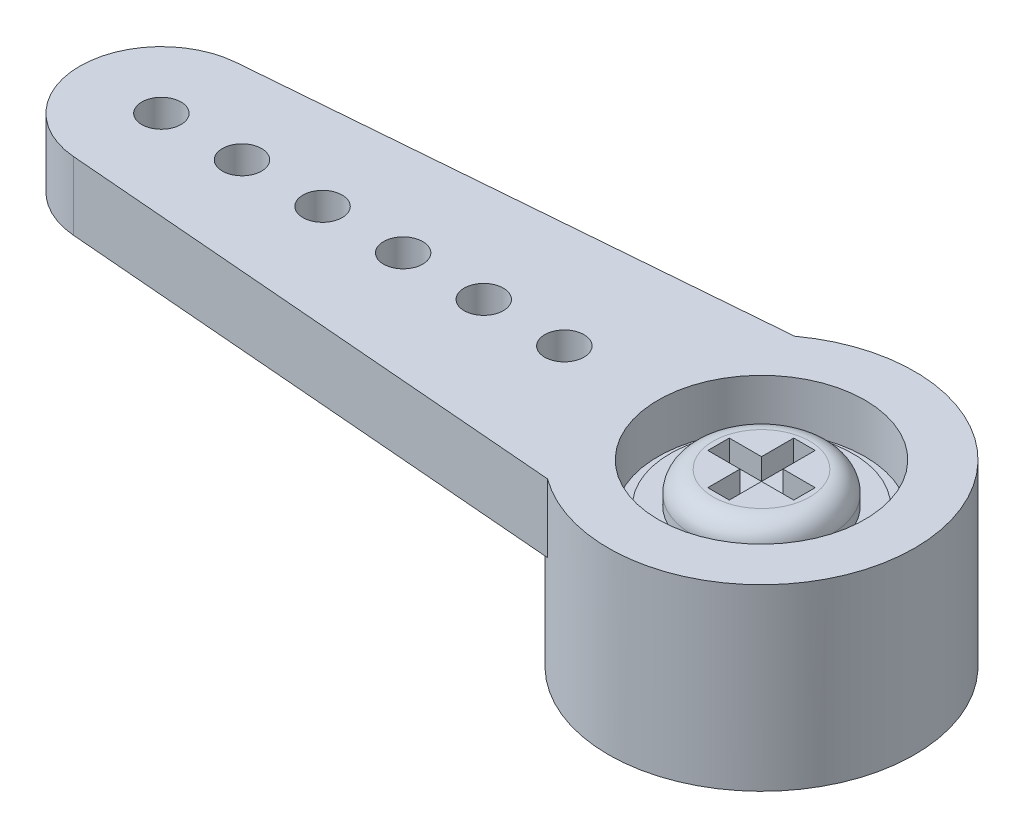
ISO-10303-21;
HEADER;
FILE_DESCRIPTION(('STEP AP214'),'2;1');
FILE_NAME('part.step','',(''),(''),'','','');
FILE_SCHEMA(('AUTOMOTIVE_DESIGN { 1 0 10303 214 1 1 1 1 }'));
ENDSEC;
DATA;
#1=APPLICATION_CONTEXT('core data for automotive mechanical design processes');
#2=APPLICATION_PROTOCOL_DEFINITION('international standard','automotive_design',2000,#1);
#3=PRODUCT_CONTEXT('',#1,'mechanical');
#4=PRODUCT('Part','Part','',(#3));
#5=PRODUCT_RELATED_PRODUCT_CATEGORY('part','',(#4));
#6=PRODUCT_DEFINITION_FORMATION('','',#4);
#7=PRODUCT_DEFINITION_CONTEXT('part definition',#1,'design');
#8=PRODUCT_DEFINITION('design','',#6,#7);
#9=PRODUCT_DEFINITION_SHAPE('','',#8);
#10=(LENGTH_UNIT() NAMED_UNIT(*) SI_UNIT(.MILLI.,.METRE.));
#11=(NAMED_UNIT(*) PLANE_ANGLE_UNIT() SI_UNIT($,.RADIAN.));
#12=(NAMED_UNIT(*) SI_UNIT($,.STERADIAN.) SOLID_ANGLE_UNIT());
#13=UNCERTAINTY_MEASURE_WITH_UNIT(LENGTH_MEASURE(1.E-05),#10,'distance_accuracy_value','');
#14=(GEOMETRIC_REPRESENTATION_CONTEXT(3) GLOBAL_UNCERTAINTY_ASSIGNED_CONTEXT((#13)) GLOBAL_UNIT_ASSIGNED_CONTEXT((#10,
#11,#12)) REPRESENTATION_CONTEXT('',''));
#15=CARTESIAN_POINT('',(0.,0.,0.));
#16=DIRECTION('',(0.,0.,1.));
#17=DIRECTION('',(1.,0.,0.));
#18=AXIS2_PLACEMENT_3D('',#15,#16,#17);
#19=CARTESIAN_POINT('',(0.,0.6604,0.));
#20=DIRECTION('',(0.,1.,0.));
#21=DIRECTION('',(0.,0.,1.));
#22=AXIS2_PLACEMENT_3D('',#19,#20,#21);
#23=PLANE('',#22);
#24=CARTESIAN_POINT('',(0.,0.6604,0.));
#25=DIRECTION('',(0.,1.,0.));
#26=DIRECTION('',(0.,0.,1.));
#27=AXIS2_PLACEMENT_3D('',#24,#25,#26);
#28=CIRCLE('',#27,2.159);
#29=CARTESIAN_POINT('',(0.,0.6604,2.159));
#30=VERTEX_POINT('',#29);
#31=EDGE_CURVE('E262',#30,#30,#28,.T.);
#32=ORIENTED_EDGE('',*,*,#31,.T.);
#33=EDGE_LOOP('',(#32));
#34=FACE_BOUND('',#33,.T.);
#35=CARTESIAN_POINT('',(0.,0.6604,0.));
#36=DIRECTION('',(0.,1.,0.));
#37=DIRECTION('',(0.,0.,1.));
#38=AXIS2_PLACEMENT_3D('',#35,#36,#37);
#39=CIRCLE('',#38,1.651);
#40=CARTESIAN_POINT('',(0.,0.6604,-1.651));
#41=VERTEX_POINT('',#40);
#42=EDGE_CURVE('E239',#41,#41,#39,.T.);
#43=ORIENTED_EDGE('',*,*,#42,.F.);
#44=EDGE_LOOP('',(#43));
#45=FACE_BOUND('',#44,.T.);
#46=ADVANCED_FACE('F32',(#34,#45),#23,.T.);
#47=CARTESIAN_POINT('',(0.,0.4572,0.));
#48=DIRECTION('',(0.,1.,0.));
#49=DIRECTION('',(0.,0.,1.));
#50=AXIS2_PLACEMENT_3D('',#47,#48,#49);
#51=PLANE('',#50);
#52=CARTESIAN_POINT('',(0.,0.4572,0.));
#53=DIRECTION('',(0.,1.,0.));
#54=DIRECTION('',(0.,0.,1.));
#55=AXIS2_PLACEMENT_3D('',#52,#53,#54);
#56=CIRCLE('',#55,2.44475);
#57=CARTESIAN_POINT('',(0.,0.4572,2.44475));
#58=VERTEX_POINT('',#57);
#59=EDGE_CURVE('E274',#58,#58,#56,.T.);
#60=ORIENTED_EDGE('',*,*,#59,.T.);
#61=EDGE_LOOP('',(#60));
#62=FACE_BOUND('',#61,.T.);
#63=CARTESIAN_POINT('',(0.,0.4572,0.));
#64=DIRECTION('',(0.,1.,0.));
#65=DIRECTION('',(0.,0.,1.));
#66=AXIS2_PLACEMENT_3D('',#63,#64,#65);
#67=CIRCLE('',#66,2.159);
#68=CARTESIAN_POINT('',(0.,0.4572,2.159));
#69=VERTEX_POINT('',#68);
#70=EDGE_CURVE('E261',#69,#69,#67,.T.);
#71=ORIENTED_EDGE('',*,*,#70,.F.);
#72=EDGE_LOOP('',(#71));
#73=FACE_BOUND('',#72,.T.);
#74=ADVANCED_FACE('F360',(#62,#73),#51,.T.);
#75=CARTESIAN_POINT('',(0.,-2.6162,0.));
#76=DIRECTION('',(0.,1.,0.));
#77=DIRECTION('',(0.,0.,1.));
#78=AXIS2_PLACEMENT_3D('',#75,#76,#77);
#79=CYLINDRICAL_SURFACE('',#78,1.27);
#80=CARTESIAN_POINT('',(0.,0.4572,0.));
#81=DIRECTION('',(0.,1.,0.));
#82=DIRECTION('',(0.,0.,1.));
#83=AXIS2_PLACEMENT_3D('',#80,#81,#82);
#84=CIRCLE('',#83,1.27);
#85=CARTESIAN_POINT('',(0.,0.4572,1.27));
#86=VERTEX_POINT('',#85);
#87=EDGE_CURVE('E277',#86,#86,#84,.F.);
#88=ORIENTED_EDGE('',*,*,#87,.F.);
#89=EDGE_LOOP('',(#88));
#90=FACE_BOUND('',#89,.T.);
#91=CARTESIAN_POINT('',(0.,-0.2794,0.));
#92=DIRECTION('',(0.,-1.,0.));
#93=DIRECTION('',(0.,0.,-1.));
#94=AXIS2_PLACEMENT_3D('',#91,#92,#93);
#95=CIRCLE('',#94,1.27);
#96=CARTESIAN_POINT('',(0.,-0.2794,-1.27));
#97=VERTEX_POINT('',#96);
#98=EDGE_CURVE('E271',#97,#97,#95,.F.);
#99=ORIENTED_EDGE('',*,*,#98,.F.);
#100=EDGE_LOOP('',(#99));
#101=FACE_BOUND('',#100,.T.);
#102=ADVANCED_FACE('F366',(#90,#101),#79,.F.);
#103=CARTESIAN_POINT('',(0.,1.6129,0.));
#104=DIRECTION('',(0.,-1.,0.));
#105=DIRECTION('',(0.,0.,-1.));
#106=AXIS2_PLACEMENT_3D('',#103,#104,#105);
#107=CYLINDRICAL_SURFACE('',#106,3.6195);
#108=DIRECTION('',(0.,-1.,0.));
#109=VECTOR('',#108,1.);
#110=CARTESIAN_POINT('',(-2.13741415032277,1.6129,2.921));
#111=LINE('',#110,#109);
#112=CARTESIAN_POINT('',(-2.13741415032277,1.6129,2.921));
#113=VERTEX_POINT('',#112);
#114=CARTESIAN_POINT('',(-2.13741415032277,0.,2.921));
#115=VERTEX_POINT('',#114);
#116=EDGE_CURVE('E316',#113,#115,#111,.T.);
#117=ORIENTED_EDGE('',*,*,#116,.T.);
#118=CARTESIAN_POINT('',(0.,0.,0.));
#119=DIRECTION('',(0.,1.,0.));
#120=DIRECTION('',(0.,0.,1.));
#121=AXIS2_PLACEMENT_3D('',#118,#119,#120);
#122=CIRCLE('',#121,3.6195);
#123=CARTESIAN_POINT('',(-2.13741415032277,0.,-2.921));
#124=VERTEX_POINT('',#123);
#125=EDGE_CURVE('E329',#124,#115,#122,.T.);
#126=ORIENTED_EDGE('',*,*,#125,.F.);
#127=DIRECTION('',(0.,-1.,0.));
#128=VECTOR('',#127,1.);
#129=CARTESIAN_POINT('',(-2.13741415032277,1.6129,-2.921));
#130=LINE('',#129,#128);
#131=CARTESIAN_POINT('',(-2.13741415032277,1.6129,-2.921));
#132=VERTEX_POINT('',#131);
#133=EDGE_CURVE('E327',#132,#124,#130,.T.);
#134=ORIENTED_EDGE('',*,*,#133,.F.);
#135=CARTESIAN_POINT('',(0.,1.6129,0.));
#136=DIRECTION('',(0.,1.,0.));
#137=DIRECTION('',(0.,0.,1.));
#138=AXIS2_PLACEMENT_3D('',#135,#136,#137);
#139=CIRCLE('',#138,3.6195);
#140=EDGE_CURVE('E309',#113,#132,#139,.T.);
#141=ORIENTED_EDGE('',*,*,#140,.F.);
#142=EDGE_LOOP('',(#117,#126,#134,#141));
#143=FACE_BOUND('',#142,.T.);
#144=CARTESIAN_POINT('',(0.,-2.6162,0.));
#145=DIRECTION('',(0.,1.,0.));
#146=DIRECTION('',(0.,0.,1.));
#147=AXIS2_PLACEMENT_3D('',#144,#145,#146);
#148=CIRCLE('',#147,3.6195);
#149=CARTESIAN_POINT('',(0.,-2.6162,3.6195));
#150=VERTEX_POINT('',#149);
#151=EDGE_CURVE('E305',#150,#150,#148,.T.);
#152=ORIENTED_EDGE('',*,*,#151,.T.);
#153=EDGE_LOOP('',(#152));
#154=FACE_BOUND('',#153,.T.);
#155=ADVANCED_FACE('F417',(#143,#154),#107,.T.);
#156=CARTESIAN_POINT('',(-14.3430596900559,1.6129,-1.92399194172469));
#157=DIRECTION('',(0.0814130180562945,0.,0.996680450541178));
#158=DIRECTION('',(0.996680450541178,0.,-0.0814130180562945));
#159=AXIS2_PLACEMENT_3D('',#156,#157,#158);
#160=PLANE('',#159);
#161=DIRECTION('',(-0.996680450541178,0.,0.0814130180562945));
#162=VECTOR('',#161,1.);
#163=CARTESIAN_POINT('',(-14.3430596900559,0.,-1.92399194172469));
#164=LINE('',#163,#162);
#165=CARTESIAN_POINT('',(-14.3430596900559,0.,-1.92399194172469));
#166=VERTEX_POINT('',#165);
#167=EDGE_CURVE('E308',#124,#166,#164,.T.);
#168=ORIENTED_EDGE('',*,*,#167,.T.);
#169=DIRECTION('',(0.,-1.,0.));
#170=VECTOR('',#169,1.);
#171=CARTESIAN_POINT('',(-14.3430596900559,1.6129,-1.92399194172469));
#172=LINE('',#171,#170);
#173=CARTESIAN_POINT('',(-14.3430596900559,1.6129,-1.92399194172469));
#174=VERTEX_POINT('',#173);
#175=EDGE_CURVE('E325',#174,#166,#172,.T.);
#176=ORIENTED_EDGE('',*,*,#175,.F.);
#177=DIRECTION('',(-0.996680450541178,0.,0.0814130180562945));
#178=VECTOR('',#177,1.);
#179=CARTESIAN_POINT('',(-14.3430596900559,1.6129,-1.92399194172469));
#180=LINE('',#179,#178);
#181=EDGE_CURVE('E83',#132,#174,#180,.T.);
#182=ORIENTED_EDGE('',*,*,#181,.F.);
#183=ORIENTED_EDGE('',*,*,#133,.T.);
#184=EDGE_LOOP('',(#168,#176,#182,#183));
#185=FACE_BOUND('',#184,.T.);
#186=ADVANCED_FACE('F441',(#185),#160,.F.);
#187=CARTESIAN_POINT('',(-14.1859,1.6129,0.));
#188=DIRECTION('',(0.,-1.,0.));
#189=DIRECTION('',(0.,0.,-1.));
#190=AXIS2_PLACEMENT_3D('',#187,#188,#189);
#191=CYLINDRICAL_SURFACE('',#190,1.9304);
#192=CARTESIAN_POINT('',(-14.1859,0.,0.));
#193=DIRECTION('',(0.,1.,0.));
#194=DIRECTION('',(0.,0.,1.));
#195=AXIS2_PLACEMENT_3D('',#192,#193,#194);
#196=CIRCLE('',#195,1.9304);
#197=CARTESIAN_POINT('',(-14.3430596900559,0.,1.92399194172469));
#198=VERTEX_POINT('',#197);
#199=EDGE_CURVE('E75',#166,#198,#196,.T.);
#200=ORIENTED_EDGE('',*,*,#199,.T.);
#201=DIRECTION('',(0.,-1.,0.));
#202=VECTOR('',#201,1.);
#203=CARTESIAN_POINT('',(-14.3430596900559,1.6129,1.92399194172469));
#204=LINE('',#203,#202);
#205=CARTESIAN_POINT('',(-14.3430596900559,1.6129,1.92399194172469));
#206=VERTEX_POINT('',#205);
#207=EDGE_CURVE('E323',#206,#198,#204,.T.);
#208=ORIENTED_EDGE('',*,*,#207,.F.);
#209=CARTESIAN_POINT('',(-14.1859,1.6129,0.));
#210=DIRECTION('',(0.,1.,0.));
#211=DIRECTION('',(0.,0.,1.));
#212=AXIS2_PLACEMENT_3D('',#209,#210,#211);
#213=CIRCLE('',#212,1.9304);
#214=EDGE_CURVE('E313',#174,#206,#213,.T.);
#215=ORIENTED_EDGE('',*,*,#214,.F.);
#216=ORIENTED_EDGE('',*,*,#175,.T.);
#217=EDGE_LOOP('',(#200,#208,#215,#216));
#218=FACE_BOUND('',#217,.T.);
#219=ADVANCED_FACE('F437',(#218),#191,.T.);
#220=CARTESIAN_POINT('',(-14.3430596900559,1.6129,1.92399194172469));
#221=DIRECTION('',(0.0814130180562943,0.,-0.996680450541178));
#222=DIRECTION('',(-0.996680450541178,0.,-0.0814130180562943));
#223=AXIS2_PLACEMENT_3D('',#220,#221,#222);
#224=PLANE('',#223);
#225=DIRECTION('',(0.996680450541178,0.,0.0814130180562943));
#226=VECTOR('',#225,1.);
#227=CARTESIAN_POINT('',(-14.3430596900559,0.,1.92399194172469));
#228=LINE('',#227,#226);
#229=EDGE_CURVE('E311',#198,#115,#228,.T.);
#230=ORIENTED_EDGE('',*,*,#229,.T.);
#231=ORIENTED_EDGE('',*,*,#116,.F.);
#232=DIRECTION('',(0.996680450541178,0.,0.0814130180562943));
#233=VECTOR('',#232,1.);
#234=CARTESIAN_POINT('',(-14.3430596900559,1.6129,1.92399194172469));
#235=LINE('',#234,#233);
#236=EDGE_CURVE('E56',#206,#113,#235,.T.);
#237=ORIENTED_EDGE('',*,*,#236,.F.);
#238=ORIENTED_EDGE('',*,*,#207,.T.);
#239=EDGE_LOOP('',(#230,#231,#237,#238));
#240=FACE_BOUND('',#239,.T.);
#241=ADVANCED_FACE('F430',(#240),#224,.F.);
#242=CARTESIAN_POINT('',(0.,1.6129,0.));
#243=DIRECTION('',(0.,1.,0.));
#244=DIRECTION('',(0.,0.,1.));
#245=AXIS2_PLACEMENT_3D('',#242,#243,#244);
#246=PLANE('',#245);
#247=CARTESIAN_POINT('',(0.,1.6129,0.));
#248=DIRECTION('',(0.,1.,0.));
#249=DIRECTION('',(0.,0.,1.));
#250=AXIS2_PLACEMENT_3D('',#247,#248,#249);
#251=CIRCLE('',#250,2.44475);
#252=CARTESIAN_POINT('',(0.,1.6129,2.44475));
#253=VERTEX_POINT('',#252);
#254=EDGE_CURVE('E278',#253,#253,#251,.T.);
#255=ORIENTED_EDGE('',*,*,#254,.F.);
#256=EDGE_LOOP('',(#255));
#257=FACE_BOUND('',#256,.T.);
#258=CARTESIAN_POINT('',(-12.2809,1.6129,0.));
#259=DIRECTION('',(0.,1.,0.));
#260=DIRECTION('',(0.,0.,1.));
#261=AXIS2_PLACEMENT_3D('',#258,#259,#260);
#262=CIRCLE('',#261,0.46355);
#263=CARTESIAN_POINT('',(-12.2809,1.6129,0.46355));
#264=VERTEX_POINT('',#263);
#265=EDGE_CURVE('E281',#264,#264,#262,.T.);
#266=ORIENTED_EDGE('',*,*,#265,.F.);
#267=EDGE_LOOP('',(#266));
#268=FACE_BOUND('',#267,.T.);
#269=CARTESIAN_POINT('',(-10.3759,1.6129,0.));
#270=DIRECTION('',(0.,1.,0.));
#271=DIRECTION('',(0.,0.,1.));
#272=AXIS2_PLACEMENT_3D('',#269,#270,#271);
#273=CIRCLE('',#272,0.46355);
#274=CARTESIAN_POINT('',(-10.3759,1.6129,0.46355));
#275=VERTEX_POINT('',#274);
#276=EDGE_CURVE('E285',#275,#275,#273,.T.);
#277=ORIENTED_EDGE('',*,*,#276,.F.);
#278=EDGE_LOOP('',(#277));
#279=FACE_BOUND('',#278,.T.);
#280=CARTESIAN_POINT('',(-8.4709,1.6129,0.));
#281=DIRECTION('',(0.,1.,0.));
#282=DIRECTION('',(0.,0.,1.));
#283=AXIS2_PLACEMENT_3D('',#280,#281,#282);
#284=CIRCLE('',#283,0.46355);
#285=CARTESIAN_POINT('',(-8.4709,1.6129,0.46355));
#286=VERTEX_POINT('',#285);
#287=EDGE_CURVE('E289',#286,#286,#284,.T.);
#288=ORIENTED_EDGE('',*,*,#287,.F.);
#289=EDGE_LOOP('',(#288));
#290=FACE_BOUND('',#289,.T.);
#291=CARTESIAN_POINT('',(-6.5659,1.6129,0.));
#292=DIRECTION('',(0.,1.,0.));
#293=DIRECTION('',(0.,0.,1.));
#294=AXIS2_PLACEMENT_3D('',#291,#292,#293);
#295=CIRCLE('',#294,0.46355);
#296=CARTESIAN_POINT('',(-6.5659,1.6129,0.46355));
#297=VERTEX_POINT('',#296);
#298=EDGE_CURVE('E293',#297,#297,#295,.T.);
#299=ORIENTED_EDGE('',*,*,#298,.F.);
#300=EDGE_LOOP('',(#299));
#301=FACE_BOUND('',#300,.T.);
#302=CARTESIAN_POINT('',(-4.6609,1.6129,0.));
#303=DIRECTION('',(0.,1.,0.));
#304=DIRECTION('',(0.,0.,1.));
#305=AXIS2_PLACEMENT_3D('',#302,#303,#304);
#306=CIRCLE('',#305,0.46355);
#307=CARTESIAN_POINT('',(-4.6609,1.6129,0.46355));
#308=VERTEX_POINT('',#307);
#309=EDGE_CURVE('E297',#308,#308,#306,.T.);
#310=ORIENTED_EDGE('',*,*,#309,.F.);
#311=EDGE_LOOP('',(#310));
#312=FACE_BOUND('',#311,.T.);
#313=CARTESIAN_POINT('',(-14.1859,1.6129,0.));
#314=DIRECTION('',(0.,1.,0.));
#315=DIRECTION('',(0.,0.,1.));
#316=AXIS2_PLACEMENT_3D('',#313,#314,#315);
#317=CIRCLE('',#316,0.46355);
#318=CARTESIAN_POINT('',(-14.1859,1.6129,0.463550000000002));
#319=VERTEX_POINT('',#318);
#320=EDGE_CURVE('E301',#319,#319,#317,.T.);
#321=ORIENTED_EDGE('',*,*,#320,.F.);
#322=EDGE_LOOP('',(#321));
#323=FACE_BOUND('',#322,.T.);
#324=ORIENTED_EDGE('',*,*,#236,.T.);
#325=ORIENTED_EDGE('',*,*,#140,.T.);
#326=ORIENTED_EDGE('',*,*,#181,.T.);
#327=ORIENTED_EDGE('',*,*,#214,.T.);
#328=EDGE_LOOP('',(#324,#325,#326,#327));
#329=FACE_BOUND('',#328,.T.);
#330=ADVANCED_FACE('F427',(#257,#268,#279,#290,#301,#312,#323,#329),#246,.T.);
#331=CARTESIAN_POINT('',(0.,0.,0.));
#332=DIRECTION('',(0.,1.,0.));
#333=DIRECTION('',(0.,0.,1.));
#334=AXIS2_PLACEMENT_3D('',#331,#332,#333);
#335=PLANE('',#334);
#336=CARTESIAN_POINT('',(-12.2809,0.,0.));
#337=DIRECTION('',(0.,1.,0.));
#338=DIRECTION('',(0.,0.,1.));
#339=AXIS2_PLACEMENT_3D('',#336,#337,#338);
#340=CIRCLE('',#339,0.46355);
#341=CARTESIAN_POINT('',(-12.2809,0.,0.46355));
#342=VERTEX_POINT('',#341);
#343=EDGE_CURVE('E284',#342,#342,#340,.T.);
#344=ORIENTED_EDGE('',*,*,#343,.T.);
#345=EDGE_LOOP('',(#344));
#346=FACE_BOUND('',#345,.T.);
#347=CARTESIAN_POINT('',(-10.3759,0.,0.));
#348=DIRECTION('',(0.,1.,0.));
#349=DIRECTION('',(0.,0.,1.));
#350=AXIS2_PLACEMENT_3D('',#347,#348,#349);
#351=CIRCLE('',#350,0.46355);
#352=CARTESIAN_POINT('',(-10.3759,0.,0.46355));
#353=VERTEX_POINT('',#352);
#354=EDGE_CURVE('E288',#353,#353,#351,.T.);
#355=ORIENTED_EDGE('',*,*,#354,.T.);
#356=EDGE_LOOP('',(#355));
#357=FACE_BOUND('',#356,.T.);
#358=CARTESIAN_POINT('',(-8.4709,0.,0.));
#359=DIRECTION('',(0.,1.,0.));
#360=DIRECTION('',(0.,0.,1.));
#361=AXIS2_PLACEMENT_3D('',#358,#359,#360);
#362=CIRCLE('',#361,0.46355);
#363=CARTESIAN_POINT('',(-8.4709,0.,0.46355));
#364=VERTEX_POINT('',#363);
#365=EDGE_CURVE('E292',#364,#364,#362,.T.);
#366=ORIENTED_EDGE('',*,*,#365,.T.);
#367=EDGE_LOOP('',(#366));
#368=FACE_BOUND('',#367,.T.);
#369=CARTESIAN_POINT('',(-6.5659,0.,0.));
#370=DIRECTION('',(0.,1.,0.));
#371=DIRECTION('',(0.,0.,1.));
#372=AXIS2_PLACEMENT_3D('',#369,#370,#371);
#373=CIRCLE('',#372,0.46355);
#374=CARTESIAN_POINT('',(-6.5659,0.,0.46355));
#375=VERTEX_POINT('',#374);
#376=EDGE_CURVE('E296',#375,#375,#373,.T.);
#377=ORIENTED_EDGE('',*,*,#376,.T.);
#378=EDGE_LOOP('',(#377));
#379=FACE_BOUND('',#378,.T.);
#380=CARTESIAN_POINT('',(-4.6609,0.,0.));
#381=DIRECTION('',(0.,1.,0.));
#382=DIRECTION('',(0.,0.,1.));
#383=AXIS2_PLACEMENT_3D('',#380,#381,#382);
#384=CIRCLE('',#383,0.46355);
#385=CARTESIAN_POINT('',(-4.6609,0.,0.46355));
#386=VERTEX_POINT('',#385);
#387=EDGE_CURVE('E300',#386,#386,#384,.T.);
#388=ORIENTED_EDGE('',*,*,#387,.T.);
#389=EDGE_LOOP('',(#388));
#390=FACE_BOUND('',#389,.T.);
#391=CARTESIAN_POINT('',(-14.1859,0.,0.));
#392=DIRECTION('',(0.,1.,0.));
#393=DIRECTION('',(0.,0.,1.));
#394=AXIS2_PLACEMENT_3D('',#391,#392,#393);
#395=CIRCLE('',#394,0.46355);
#396=CARTESIAN_POINT('',(-14.1859,0.,0.463550000000002));
#397=VERTEX_POINT('',#396);
#398=EDGE_CURVE('E304',#397,#397,#395,.T.);
#399=ORIENTED_EDGE('',*,*,#398,.T.);
#400=EDGE_LOOP('',(#399));
#401=FACE_BOUND('',#400,.T.);
#402=ORIENTED_EDGE('',*,*,#167,.F.);
#403=ORIENTED_EDGE('',*,*,#125,.T.);
#404=ORIENTED_EDGE('',*,*,#229,.F.);
#405=ORIENTED_EDGE('',*,*,#199,.F.);
#406=EDGE_LOOP('',(#402,#403,#404,#405));
#407=FACE_BOUND('',#406,.T.);
#408=ADVANCED_FACE('F425',(#346,#357,#368,#379,#390,#401,#407),#335,.F.);
#409=CARTESIAN_POINT('',(0.,-2.6162,0.));
#410=DIRECTION('',(0.,1.,0.));
#411=DIRECTION('',(0.,0.,1.));
#412=AXIS2_PLACEMENT_3D('',#409,#410,#411);
#413=PLANE('',#412);
#414=CARTESIAN_POINT('',(0.,-2.6162,0.));
#415=DIRECTION('',(0.,-1.,0.));
#416=DIRECTION('',(0.,0.,-1.));
#417=AXIS2_PLACEMENT_3D('',#414,#415,#416);
#418=CIRCLE('',#417,2.286);
#419=CARTESIAN_POINT('',(0.,-2.6162,-2.286));
#420=VERTEX_POINT('',#419);
#421=EDGE_CURVE('E265',#420,#420,#418,.T.);
#422=ORIENTED_EDGE('',*,*,#421,.F.);
#423=EDGE_LOOP('',(#422));
#424=FACE_BOUND('',#423,.T.);
#425=ORIENTED_EDGE('',*,*,#151,.F.);
#426=EDGE_LOOP('',(#425));
#427=FACE_BOUND('',#426,.T.);
#428=ADVANCED_FACE('F421',(#424,#427),#413,.F.);
#429=CARTESIAN_POINT('',(-14.1859,-2.6162,0.));
#430=DIRECTION('',(0.,1.,0.));
#431=DIRECTION('',(0.,0.,1.));
#432=AXIS2_PLACEMENT_3D('',#429,#430,#431);
#433=CYLINDRICAL_SURFACE('',#432,0.46355);
#434=ORIENTED_EDGE('',*,*,#320,.T.);
#435=EDGE_LOOP('',(#434));
#436=FACE_BOUND('',#435,.T.);
#437=ORIENTED_EDGE('',*,*,#398,.F.);
#438=EDGE_LOOP('',(#437));
#439=FACE_BOUND('',#438,.T.);
#440=ADVANCED_FACE('F413',(#436,#439),#433,.F.);
#441=CARTESIAN_POINT('',(-4.6609,-2.6162,0.));
#442=DIRECTION('',(0.,1.,0.));
#443=DIRECTION('',(0.,0.,1.));
#444=AXIS2_PLACEMENT_3D('',#441,#442,#443);
#445=CYLINDRICAL_SURFACE('',#444,0.46355);
#446=ORIENTED_EDGE('',*,*,#309,.T.);
#447=EDGE_LOOP('',(#446));
#448=FACE_BOUND('',#447,.T.);
#449=ORIENTED_EDGE('',*,*,#387,.F.);
#450=EDGE_LOOP('',(#449));
#451=FACE_BOUND('',#450,.T.);
#452=ADVANCED_FACE('F409',(#448,#451),#445,.F.);
#453=CARTESIAN_POINT('',(-6.5659,-2.6162,0.));
#454=DIRECTION('',(0.,1.,0.));
#455=DIRECTION('',(0.,0.,1.));
#456=AXIS2_PLACEMENT_3D('',#453,#454,#455);
#457=CYLINDRICAL_SURFACE('',#456,0.46355);
#458=ORIENTED_EDGE('',*,*,#298,.T.);
#459=EDGE_LOOP('',(#458));
#460=FACE_BOUND('',#459,.T.);
#461=ORIENTED_EDGE('',*,*,#376,.F.);
#462=EDGE_LOOP('',(#461));
#463=FACE_BOUND('',#462,.T.);
#464=ADVANCED_FACE('F405',(#460,#463),#457,.F.);
#465=CARTESIAN_POINT('',(-8.4709,-2.6162,0.));
#466=DIRECTION('',(0.,1.,0.));
#467=DIRECTION('',(0.,0.,1.));
#468=AXIS2_PLACEMENT_3D('',#465,#466,#467);
#469=CYLINDRICAL_SURFACE('',#468,0.46355);
#470=ORIENTED_EDGE('',*,*,#287,.T.);
#471=EDGE_LOOP('',(#470));
#472=FACE_BOUND('',#471,.T.);
#473=ORIENTED_EDGE('',*,*,#365,.F.);
#474=EDGE_LOOP('',(#473));
#475=FACE_BOUND('',#474,.T.);
#476=ADVANCED_FACE('F401',(#472,#475),#469,.F.);
#477=CARTESIAN_POINT('',(-10.3759,-2.6162,0.));
#478=DIRECTION('',(0.,1.,0.));
#479=DIRECTION('',(0.,0.,1.));
#480=AXIS2_PLACEMENT_3D('',#477,#478,#479);
#481=CYLINDRICAL_SURFACE('',#480,0.46355);
#482=ORIENTED_EDGE('',*,*,#276,.T.);
#483=EDGE_LOOP('',(#482));
#484=FACE_BOUND('',#483,.T.);
#485=ORIENTED_EDGE('',*,*,#354,.F.);
#486=EDGE_LOOP('',(#485));
#487=FACE_BOUND('',#486,.T.);
#488=ADVANCED_FACE('F397',(#484,#487),#481,.F.);
#489=CARTESIAN_POINT('',(-12.2809,-2.6162,0.));
#490=DIRECTION('',(0.,1.,0.));
#491=DIRECTION('',(0.,0.,1.));
#492=AXIS2_PLACEMENT_3D('',#489,#490,#491);
#493=CYLINDRICAL_SURFACE('',#492,0.46355);
#494=ORIENTED_EDGE('',*,*,#265,.T.);
#495=EDGE_LOOP('',(#494));
#496=FACE_BOUND('',#495,.T.);
#497=ORIENTED_EDGE('',*,*,#343,.F.);
#498=EDGE_LOOP('',(#497));
#499=FACE_BOUND('',#498,.T.);
#500=ADVANCED_FACE('F393',(#496,#499),#493,.F.);
#501=CARTESIAN_POINT('',(0.,0.4572,0.));
#502=DIRECTION('',(0.,1.,0.));
#503=DIRECTION('',(0.,0.,1.));
#504=AXIS2_PLACEMENT_3D('',#501,#502,#503);
#505=CYLINDRICAL_SURFACE('',#504,2.44475);
#506=ORIENTED_EDGE('',*,*,#59,.F.);
#507=EDGE_LOOP('',(#506));
#508=FACE_BOUND('',#507,.T.);
#509=ORIENTED_EDGE('',*,*,#254,.T.);
#510=EDGE_LOOP('',(#509));
#511=FACE_BOUND('',#510,.T.);
#512=ADVANCED_FACE('F386',(#508,#511),#505,.F.);
#513=CARTESIAN_POINT('',(0.,-0.2794,0.));
#514=DIRECTION('',(0.,-1.,0.));
#515=DIRECTION('',(0.,0.,-1.));
#516=AXIS2_PLACEMENT_3D('',#513,#514,#515);
#517=PLANE('',#516);
#518=CARTESIAN_POINT('',(0.,-0.2794,0.));
#519=DIRECTION('',(0.,-1.,0.));
#520=DIRECTION('',(0.,0.,-1.));
#521=AXIS2_PLACEMENT_3D('',#518,#519,#520);
#522=CIRCLE('',#521,2.286);
#523=CARTESIAN_POINT('',(0.,-0.2794,-2.286));
#524=VERTEX_POINT('',#523);
#525=EDGE_CURVE('E268',#524,#524,#522,.T.);
#526=ORIENTED_EDGE('',*,*,#525,.T.);
#527=EDGE_LOOP('',(#526));
#528=FACE_BOUND('',#527,.T.);
#529=ORIENTED_EDGE('',*,*,#98,.T.);
#530=EDGE_LOOP('',(#529));
#531=FACE_BOUND('',#530,.T.);
#532=ADVANCED_FACE('F383',(#528,#531),#517,.T.);
#533=CARTESIAN_POINT('',(0.,-0.2794,0.));
#534=DIRECTION('',(0.,-1.,0.));
#535=DIRECTION('',(0.,0.,-1.));
#536=AXIS2_PLACEMENT_3D('',#533,#534,#535);
#537=CYLINDRICAL_SURFACE('',#536,2.286);
#538=ORIENTED_EDGE('',*,*,#525,.F.);
#539=EDGE_LOOP('',(#538));
#540=FACE_BOUND('',#539,.T.);
#541=ORIENTED_EDGE('',*,*,#421,.T.);
#542=EDGE_LOOP('',(#541));
#543=FACE_BOUND('',#542,.T.);
#544=ADVANCED_FACE('F381',(#540,#543),#537,.F.);
#545=CARTESIAN_POINT('',(0.,0.6604,0.));
#546=DIRECTION('',(0.,-1.,0.));
#547=DIRECTION('',(0.,0.,-1.));
#548=AXIS2_PLACEMENT_3D('',#545,#546,#547);
#549=CYLINDRICAL_SURFACE('',#548,2.159);
#550=ORIENTED_EDGE('',*,*,#31,.F.);
#551=EDGE_LOOP('',(#550));
#552=FACE_BOUND('',#551,.T.);
#553=ORIENTED_EDGE('',*,*,#70,.T.);
#554=EDGE_LOOP('',(#553));
#555=FACE_BOUND('',#554,.T.);
#556=ADVANCED_FACE('F377',(#552,#555),#549,.T.);
#557=CARTESIAN_POINT('',(0.,0.4572,0.));
#558=DIRECTION('',(0.,1.,0.));
#559=DIRECTION('',(0.,0.,1.));
#560=AXIS2_PLACEMENT_3D('',#557,#558,#559);
#561=PLANE('',#560);
#562=ORIENTED_EDGE('',*,*,#87,.T.);
#563=EDGE_LOOP('',(#562));
#564=FACE_BOUND('',#563,.T.);
#565=ADVANCED_FACE('F374',(#564),#561,.F.);
#566=CARTESIAN_POINT('',(0.,1.4224,0.));
#567=DIRECTION('',(0.,-1.,0.));
#568=DIRECTION('',(0.,0.,-1.));
#569=AXIS2_PLACEMENT_3D('',#566,#567,#568);
#570=CYLINDRICAL_SURFACE('',#569,1.651);
#571=CARTESIAN_POINT('',(0.,0.9144,0.));
#572=DIRECTION('',(0.,1.,0.));
#573=DIRECTION('',(0.,0.,1.));
#574=AXIS2_PLACEMENT_3D('',#571,#572,#573);
#575=CIRCLE('',#574,1.651);
#576=CARTESIAN_POINT('',(0.,0.9144,-1.651));
#577=VERTEX_POINT('',#576);
#578=EDGE_CURVE('E11',#577,#577,#575,.F.);
#579=CARTESIAN_POINT('',(0.,0.9144,-1.651));
#580=CARTESIAN_POINT('',(0.,0.911754166666666,-1.651));
#581=CARTESIAN_POINT('',(0.,0.909108333333333,-1.651));
#582=CARTESIAN_POINT('',(0.,0.903816666666666,-1.651));
#583=CARTESIAN_POINT('',(0.,0.901170833333333,-1.651));
#584=CARTESIAN_POINT('',(0.,0.895879166666666,-1.651));
#585=CARTESIAN_POINT('',(0.,0.893233333333333,-1.651));
#586=CARTESIAN_POINT('',(0.,0.887941666666667,-1.651));
#587=CARTESIAN_POINT('',(0.,0.885295833333333,-1.651));
#588=CARTESIAN_POINT('',(0.,0.880004166666666,-1.651));
#589=CARTESIAN_POINT('',(0.,0.877358333333333,-1.651));
#590=CARTESIAN_POINT('',(0.,0.872066666666666,-1.651));
#591=CARTESIAN_POINT('',(0.,0.869420833333333,-1.651));
#592=CARTESIAN_POINT('',(0.,0.864129166666667,-1.651));
#593=CARTESIAN_POINT('',(0.,0.861483333333333,-1.651));
#594=CARTESIAN_POINT('',(0.,0.856191666666666,-1.651));
#595=CARTESIAN_POINT('',(0.,0.853545833333333,-1.651));
#596=CARTESIAN_POINT('',(0.,0.848254166666666,-1.651));
#597=CARTESIAN_POINT('',(0.,0.845608333333333,-1.651));
#598=CARTESIAN_POINT('',(0.,0.840316666666666,-1.651));
#599=CARTESIAN_POINT('',(0.,0.837670833333333,-1.651));
#600=CARTESIAN_POINT('',(0.,0.832379166666666,-1.651));
#601=CARTESIAN_POINT('',(0.,0.829733333333333,-1.651));
#602=CARTESIAN_POINT('',(0.,0.824441666666667,-1.651));
#603=CARTESIAN_POINT('',(0.,0.821795833333333,-1.651));
#604=CARTESIAN_POINT('',(0.,0.816504166666666,-1.651));
#605=CARTESIAN_POINT('',(0.,0.813858333333333,-1.651));
#606=CARTESIAN_POINT('',(0.,0.808566666666666,-1.651));
#607=CARTESIAN_POINT('',(0.,0.805920833333333,-1.651));
#608=CARTESIAN_POINT('',(0.,0.800629166666667,-1.651));
#609=CARTESIAN_POINT('',(0.,0.797983333333333,-1.651));
#610=CARTESIAN_POINT('',(0.,0.792691666666667,-1.651));
#611=CARTESIAN_POINT('',(0.,0.790045833333333,-1.651));
#612=CARTESIAN_POINT('',(0.,0.784754166666667,-1.651));
#613=CARTESIAN_POINT('',(0.,0.782108333333333,-1.651));
#614=CARTESIAN_POINT('',(0.,0.776816666666666,-1.651));
#615=CARTESIAN_POINT('',(0.,0.774170833333333,-1.651));
#616=CARTESIAN_POINT('',(0.,0.768879166666666,-1.651));
#617=CARTESIAN_POINT('',(0.,0.766233333333333,-1.651));
#618=CARTESIAN_POINT('',(0.,0.760941666666667,-1.651));
#619=CARTESIAN_POINT('',(0.,0.758295833333333,-1.651));
#620=CARTESIAN_POINT('',(0.,0.753004166666666,-1.651));
#621=CARTESIAN_POINT('',(0.,0.750358333333333,-1.651));
#622=CARTESIAN_POINT('',(0.,0.745066666666667,-1.651));
#623=CARTESIAN_POINT('',(0.,0.742420833333333,-1.651));
#624=CARTESIAN_POINT('',(0.,0.737129166666667,-1.651));
#625=CARTESIAN_POINT('',(0.,0.734483333333333,-1.651));
#626=CARTESIAN_POINT('',(0.,0.729191666666667,-1.651));
#627=CARTESIAN_POINT('',(0.,0.726545833333333,-1.651));
#628=CARTESIAN_POINT('',(0.,0.721254166666667,-1.651));
#629=CARTESIAN_POINT('',(0.,0.718608333333333,-1.651));
#630=CARTESIAN_POINT('',(0.,0.713316666666666,-1.651));
#631=CARTESIAN_POINT('',(0.,0.710670833333333,-1.651));
#632=CARTESIAN_POINT('',(0.,0.705379166666666,-1.651));
#633=CARTESIAN_POINT('',(0.,0.702733333333333,-1.651));
#634=CARTESIAN_POINT('',(0.,0.697441666666667,-1.651));
#635=CARTESIAN_POINT('',(0.,0.694795833333333,-1.651));
#636=CARTESIAN_POINT('',(0.,0.689504166666667,-1.651));
#637=CARTESIAN_POINT('',(0.,0.686858333333333,-1.651));
#638=CARTESIAN_POINT('',(0.,0.681566666666667,-1.651));
#639=CARTESIAN_POINT('',(0.,0.678920833333333,-1.651));
#640=CARTESIAN_POINT('',(0.,0.673629166666667,-1.651));
#641=CARTESIAN_POINT('',(0.,0.670983333333333,-1.651));
#642=CARTESIAN_POINT('',(0.,0.665691666666667,-1.651));
#643=CARTESIAN_POINT('',(0.,0.663045833333333,-1.651));
#644=CARTESIAN_POINT('',(0.,0.6604,-1.651));
#645=B_SPLINE_CURVE_WITH_KNOTS('',3,(#579,#580,#581,#582,#583,#584,#585,#586,#587,#588,#589,
#590,#591,#592,#593,#594,#595,#596,#597,#598,#599,#600,#601,#602,#603,#604,#605,#606,#607,#608,
#609,#610,#611,#612,#613,#614,#615,#616,#617,#618,#619,#620,#621,#622,#623,#624,#625,#626,#627,
#628,#629,#630,#631,#632,#633,#634,#635,#636,#637,#638,#639,#640,#641,#642,#643,#644),
.UNSPECIFIED.,.F.,.F.,(4,2,2,2,2,2,2,2,2,2,2,2,2,2,2,2,2,2,2,2,2,2,2,2,2,2,2,2,2,2,2,2,4),(0.,
0.00793750000000002,0.015875,0.0238125,0.03175,0.0396875,0.0476249999999999,0.0555624999999999,
0.0635,0.0714375,0.079375,0.0873124999999999,0.09525,0.1031875,0.111125,0.1190625,0.127,
0.1349375,0.142875,0.1508125,0.15875,0.1666875,0.174625,0.1825625,0.1905,0.1984375,0.206375,
0.2143125,0.22225,0.2301875,0.238125,0.2460625,0.254),.UNSPECIFIED.);
#646=EDGE_CURVE('BSEAM372',#577,#41,#645,.T.);
#647=ORIENTED_EDGE('',*,*,#578,.T.);
#648=ORIENTED_EDGE('',*,*,#42,.T.);
#649=ORIENTED_EDGE('',*,*,#646,.T.);
#650=ORIENTED_EDGE('',*,*,#646,.F.);
#651=EDGE_LOOP('',(#647,#649,#648,#650));
#652=FACE_BOUND('',#651,.T.);
#653=ADVANCED_FACE('F372',(#652),#570,.T.);
#654=CARTESIAN_POINT('',(0.,1.4224,0.));
#655=DIRECTION('',(0.,1.,0.));
#656=DIRECTION('',(0.,0.,1.));
#657=AXIS2_PLACEMENT_3D('',#654,#655,#656);
#658=PLANE('',#657);
#659=CARTESIAN_POINT('',(0.,1.4224,0.));
#660=DIRECTION('',(0.,1.,0.));
#661=DIRECTION('',(0.,0.,1.));
#662=AXIS2_PLACEMENT_3D('',#659,#660,#661);
#663=CIRCLE('',#662,1.143);
#664=CARTESIAN_POINT('',(0.,1.4224,1.143));
#665=VERTEX_POINT('',#664);
#666=EDGE_CURVE('E40',#665,#665,#663,.T.);
#667=ORIENTED_EDGE('',*,*,#666,.T.);
#668=EDGE_LOOP('',(#667));
#669=FACE_BOUND('',#668,.T.);
#670=DIRECTION('',(1.,0.,0.));
#671=VECTOR('',#670,1.);
#672=CARTESIAN_POINT('',(0.254,1.4224,0.254));
#673=LINE('',#672,#671);
#674=CARTESIAN_POINT('',(0.254,1.4224,0.254));
#675=VERTEX_POINT('',#674);
#676=CARTESIAN_POINT('',(1.016,1.4224,0.254000000000001));
#677=VERTEX_POINT('',#676);
#678=EDGE_CURVE('E47',#675,#677,#673,.T.);
#679=ORIENTED_EDGE('',*,*,#678,.F.);
#680=DIRECTION('',(0.,0.,-1.));
#681=VECTOR('',#680,1.);
#682=CARTESIAN_POINT('',(0.254,1.4224,1.016));
#683=LINE('',#682,#681);
#684=CARTESIAN_POINT('',(0.254,1.4224,1.016));
#685=VERTEX_POINT('',#684);
#686=EDGE_CURVE('E177',#685,#675,#683,.T.);
#687=ORIENTED_EDGE('',*,*,#686,.F.);
#688=DIRECTION('',(1.,0.,0.));
#689=VECTOR('',#688,1.);
#690=CARTESIAN_POINT('',(0.254,1.4224,1.016));
#691=LINE('',#690,#689);
#692=CARTESIAN_POINT('',(-0.254,1.4224,1.016));
#693=VERTEX_POINT('',#692);
#694=EDGE_CURVE('E180',#693,#685,#691,.T.);
#695=ORIENTED_EDGE('',*,*,#694,.F.);
#696=DIRECTION('',(0.,0.,1.));
#697=VECTOR('',#696,1.);
#698=CARTESIAN_POINT('',(-0.254,1.4224,1.016));
#699=LINE('',#698,#697);
#700=CARTESIAN_POINT('',(-0.254,1.4224,0.254));
#701=VERTEX_POINT('',#700);
#702=EDGE_CURVE('E232',#701,#693,#699,.T.);
#703=ORIENTED_EDGE('',*,*,#702,.F.);
#704=DIRECTION('',(1.,0.,0.));
#705=VECTOR('',#704,1.);
#706=CARTESIAN_POINT('',(-0.254,1.4224,0.254));
#707=LINE('',#706,#705);
#708=CARTESIAN_POINT('',(-1.016,1.4224,0.254));
#709=VERTEX_POINT('',#708);
#710=EDGE_CURVE('E229',#709,#701,#707,.T.);
#711=ORIENTED_EDGE('',*,*,#710,.F.);
#712=DIRECTION('',(0.,0.,1.));
#713=VECTOR('',#712,1.);
#714=CARTESIAN_POINT('',(-1.016,1.4224,0.254));
#715=LINE('',#714,#713);
#716=CARTESIAN_POINT('',(-1.016,1.4224,-0.254000000000001));
#717=VERTEX_POINT('',#716);
#718=EDGE_CURVE('E226',#717,#709,#715,.T.);
#719=ORIENTED_EDGE('',*,*,#718,.F.);
#720=DIRECTION('',(-1.,0.,0.));
#721=VECTOR('',#720,1.);
#722=CARTESIAN_POINT('',(-0.254,1.4224,-0.254));
#723=LINE('',#722,#721);
#724=CARTESIAN_POINT('',(-0.254,1.4224,-0.254));
#725=VERTEX_POINT('',#724);
#726=EDGE_CURVE('E223',#725,#717,#723,.T.);
#727=ORIENTED_EDGE('',*,*,#726,.F.);
#728=DIRECTION('',(0.,0.,1.));
#729=VECTOR('',#728,1.);
#730=CARTESIAN_POINT('',(-0.254000000000001,1.4224,-1.016));
#731=LINE('',#730,#729);
#732=CARTESIAN_POINT('',(-0.254000000000001,1.4224,-1.016));
#733=VERTEX_POINT('',#732);
#734=EDGE_CURVE('E220',#733,#725,#731,.T.);
#735=ORIENTED_EDGE('',*,*,#734,.F.);
#736=DIRECTION('',(-1.,0.,0.));
#737=VECTOR('',#736,1.);
#738=CARTESIAN_POINT('',(0.254,1.4224,-1.016));
#739=LINE('',#738,#737);
#740=CARTESIAN_POINT('',(0.254,1.4224,-1.016));
#741=VERTEX_POINT('',#740);
#742=EDGE_CURVE('E217',#741,#733,#739,.T.);
#743=ORIENTED_EDGE('',*,*,#742,.F.);
#744=DIRECTION('',(0.,0.,-1.));
#745=VECTOR('',#744,1.);
#746=CARTESIAN_POINT('',(0.254,1.4224,-1.016));
#747=LINE('',#746,#745);
#748=CARTESIAN_POINT('',(0.254,1.4224,-0.254));
#749=VERTEX_POINT('',#748);
#750=EDGE_CURVE('E214',#749,#741,#747,.T.);
#751=ORIENTED_EDGE('',*,*,#750,.F.);
#752=DIRECTION('',(-1.,0.,0.));
#753=VECTOR('',#752,1.);
#754=CARTESIAN_POINT('',(0.254,1.4224,-0.254));
#755=LINE('',#754,#753);
#756=CARTESIAN_POINT('',(1.016,1.4224,-0.254000000000001));
#757=VERTEX_POINT('',#756);
#758=EDGE_CURVE('E211',#757,#749,#755,.T.);
#759=ORIENTED_EDGE('',*,*,#758,.F.);
#760=DIRECTION('',(0.,0.,-1.));
#761=VECTOR('',#760,1.);
#762=CARTESIAN_POINT('',(1.016,1.4224,0.254000000000001));
#763=LINE('',#762,#761);
#764=EDGE_CURVE('E209',#677,#757,#763,.T.);
#765=ORIENTED_EDGE('',*,*,#764,.F.);
#766=EDGE_LOOP('',(#679,#687,#695,#703,#711,#719,#727,#735,#743,#751,#759,#765));
#767=FACE_BOUND('',#766,.T.);
#768=ADVANCED_FACE('F349',(#669,#767),#658,.T.);
#769=CARTESIAN_POINT('',(0.254,0.9144,0.254));
#770=DIRECTION('',(0.,0.,1.));
#771=DIRECTION('',(1.,0.,0.));
#772=AXIS2_PLACEMENT_3D('',#769,#770,#771);
#773=PLANE('',#772);
#774=ORIENTED_EDGE('',*,*,#678,.T.);
#775=DIRECTION('',(0.,1.,0.));
#776=VECTOR('',#775,1.);
#777=CARTESIAN_POINT('',(1.016,0.9144,0.254000000000001));
#778=LINE('',#777,#776);
#779=CARTESIAN_POINT('',(1.016,0.9144,0.254000000000001));
#780=VERTEX_POINT('',#779);
#781=EDGE_CURVE('E154',#780,#677,#778,.T.);
#782=ORIENTED_EDGE('',*,*,#781,.F.);
#783=DIRECTION('',(1.,0.,0.));
#784=VECTOR('',#783,1.);
#785=CARTESIAN_POINT('',(0.254,0.9144,0.254));
#786=LINE('',#785,#784);
#787=CARTESIAN_POINT('',(0.254,0.9144,0.254));
#788=VERTEX_POINT('',#787);
#789=EDGE_CURVE('E158',#788,#780,#786,.T.);
#790=ORIENTED_EDGE('',*,*,#789,.F.);
#791=DIRECTION('',(0.,1.,0.));
#792=VECTOR('',#791,1.);
#793=CARTESIAN_POINT('',(0.254,0.9144,0.254));
#794=LINE('',#793,#792);
#795=EDGE_CURVE('E237',#788,#675,#794,.T.);
#796=ORIENTED_EDGE('',*,*,#795,.T.);
#797=EDGE_LOOP('',(#774,#782,#790,#796));
#798=FACE_BOUND('',#797,.T.);
#799=ADVANCED_FACE('F156',(#798),#773,.F.);
#800=CARTESIAN_POINT('',(0.254,0.9144,1.016));
#801=DIRECTION('',(1.,0.,0.));
#802=DIRECTION('',(0.,0.,-1.));
#803=AXIS2_PLACEMENT_3D('',#800,#801,#802);
#804=PLANE('',#803);
#805=ORIENTED_EDGE('',*,*,#686,.T.);
#806=ORIENTED_EDGE('',*,*,#795,.F.);
#807=DIRECTION('',(0.,0.,-1.));
#808=VECTOR('',#807,1.);
#809=CARTESIAN_POINT('',(0.254,0.9144,1.016));
#810=LINE('',#809,#808);
#811=CARTESIAN_POINT('',(0.254,0.9144,1.016));
#812=VERTEX_POINT('',#811);
#813=EDGE_CURVE('E164',#812,#788,#810,.T.);
#814=ORIENTED_EDGE('',*,*,#813,.F.);
#815=DIRECTION('',(0.,1.,0.));
#816=VECTOR('',#815,1.);
#817=CARTESIAN_POINT('',(0.254,0.9144,1.016));
#818=LINE('',#817,#816);
#819=EDGE_CURVE('E240',#812,#685,#818,.T.);
#820=ORIENTED_EDGE('',*,*,#819,.T.);
#821=EDGE_LOOP('',(#805,#806,#814,#820));
#822=FACE_BOUND('',#821,.T.);
#823=ADVANCED_FACE('F545',(#822),#804,.F.);
#824=CARTESIAN_POINT('',(0.254,0.9144,1.016));
#825=DIRECTION('',(0.,0.,1.));
#826=DIRECTION('',(1.,0.,0.));
#827=AXIS2_PLACEMENT_3D('',#824,#825,#826);
#828=PLANE('',#827);
#829=ORIENTED_EDGE('',*,*,#694,.T.);
#830=ORIENTED_EDGE('',*,*,#819,.F.);
#831=DIRECTION('',(1.,0.,0.));
#832=VECTOR('',#831,1.);
#833=CARTESIAN_POINT('',(0.254,0.9144,1.016));
#834=LINE('',#833,#832);
#835=CARTESIAN_POINT('',(-0.254,0.9144,1.016));
#836=VERTEX_POINT('',#835);
#837=EDGE_CURVE('E205',#836,#812,#834,.T.);
#838=ORIENTED_EDGE('',*,*,#837,.F.);
#839=DIRECTION('',(0.,1.,0.));
#840=VECTOR('',#839,1.);
#841=CARTESIAN_POINT('',(-0.254,0.9144,1.016));
#842=LINE('',#841,#840);
#843=EDGE_CURVE('E242',#836,#693,#842,.T.);
#844=ORIENTED_EDGE('',*,*,#843,.T.);
#845=EDGE_LOOP('',(#829,#830,#838,#844));
#846=FACE_BOUND('',#845,.T.);
#847=ADVANCED_FACE('F552',(#846),#828,.F.);
#848=CARTESIAN_POINT('',(-0.254,0.9144,1.016));
#849=DIRECTION('',(-1.,0.,0.));
#850=DIRECTION('',(0.,0.,1.));
#851=AXIS2_PLACEMENT_3D('',#848,#849,#850);
#852=PLANE('',#851);
#853=ORIENTED_EDGE('',*,*,#702,.T.);
#854=ORIENTED_EDGE('',*,*,#843,.F.);
#855=DIRECTION('',(0.,0.,1.));
#856=VECTOR('',#855,1.);
#857=CARTESIAN_POINT('',(-0.254,0.9144,1.016));
#858=LINE('',#857,#856);
#859=CARTESIAN_POINT('',(-0.254,0.9144,0.254));
#860=VERTEX_POINT('',#859);
#861=EDGE_CURVE('E202',#860,#836,#858,.T.);
#862=ORIENTED_EDGE('',*,*,#861,.F.);
#863=DIRECTION('',(0.,1.,0.));
#864=VECTOR('',#863,1.);
#865=CARTESIAN_POINT('',(-0.254,0.9144,0.254));
#866=LINE('',#865,#864);
#867=EDGE_CURVE('E244',#860,#701,#866,.T.);
#868=ORIENTED_EDGE('',*,*,#867,.T.);
#869=EDGE_LOOP('',(#853,#854,#862,#868));
#870=FACE_BOUND('',#869,.T.);
#871=ADVANCED_FACE('F560',(#870),#852,.F.);
#872=CARTESIAN_POINT('',(-0.254,0.9144,0.254));
#873=DIRECTION('',(0.,0.,1.));
#874=DIRECTION('',(1.,0.,0.));
#875=AXIS2_PLACEMENT_3D('',#872,#873,#874);
#876=PLANE('',#875);
#877=ORIENTED_EDGE('',*,*,#710,.T.);
#878=ORIENTED_EDGE('',*,*,#867,.F.);
#879=DIRECTION('',(1.,0.,0.));
#880=VECTOR('',#879,1.);
#881=CARTESIAN_POINT('',(-0.254,0.9144,0.254));
#882=LINE('',#881,#880);
#883=CARTESIAN_POINT('',(-1.016,0.9144,0.254));
#884=VERTEX_POINT('',#883);
#885=EDGE_CURVE('E199',#884,#860,#882,.T.);
#886=ORIENTED_EDGE('',*,*,#885,.F.);
#887=DIRECTION('',(0.,1.,0.));
#888=VECTOR('',#887,1.);
#889=CARTESIAN_POINT('',(-1.016,0.9144,0.254));
#890=LINE('',#889,#888);
#891=EDGE_CURVE('E246',#884,#709,#890,.T.);
#892=ORIENTED_EDGE('',*,*,#891,.T.);
#893=EDGE_LOOP('',(#877,#878,#886,#892));
#894=FACE_BOUND('',#893,.T.);
#895=ADVANCED_FACE('F568',(#894),#876,.F.);
#896=CARTESIAN_POINT('',(-1.016,0.9144,0.254));
#897=DIRECTION('',(-1.,0.,0.));
#898=DIRECTION('',(0.,0.,1.));
#899=AXIS2_PLACEMENT_3D('',#896,#897,#898);
#900=PLANE('',#899);
#901=ORIENTED_EDGE('',*,*,#718,.T.);
#902=ORIENTED_EDGE('',*,*,#891,.F.);
#903=DIRECTION('',(0.,0.,1.));
#904=VECTOR('',#903,1.);
#905=CARTESIAN_POINT('',(-1.016,0.9144,0.254));
#906=LINE('',#905,#904);
#907=CARTESIAN_POINT('',(-1.016,0.9144,-0.254000000000001));
#908=VERTEX_POINT('',#907);
#909=EDGE_CURVE('E196',#908,#884,#906,.T.);
#910=ORIENTED_EDGE('',*,*,#909,.F.);
#911=DIRECTION('',(0.,1.,0.));
#912=VECTOR('',#911,1.);
#913=CARTESIAN_POINT('',(-1.016,0.9144,-0.254000000000001));
#914=LINE('',#913,#912);
#915=EDGE_CURVE('E248',#908,#717,#914,.T.);
#916=ORIENTED_EDGE('',*,*,#915,.T.);
#917=EDGE_LOOP('',(#901,#902,#910,#916));
#918=FACE_BOUND('',#917,.T.);
#919=ADVANCED_FACE('F576',(#918),#900,.F.);
#920=CARTESIAN_POINT('',(-0.254,0.9144,-0.254));
#921=DIRECTION('',(0.,0.,-1.));
#922=DIRECTION('',(-1.,0.,0.));
#923=AXIS2_PLACEMENT_3D('',#920,#921,#922);
#924=PLANE('',#923);
#925=ORIENTED_EDGE('',*,*,#726,.T.);
#926=ORIENTED_EDGE('',*,*,#915,.F.);
#927=DIRECTION('',(-1.,0.,0.));
#928=VECTOR('',#927,1.);
#929=CARTESIAN_POINT('',(-0.254,0.9144,-0.254));
#930=LINE('',#929,#928);
#931=CARTESIAN_POINT('',(-0.254,0.9144,-0.254));
#932=VERTEX_POINT('',#931);
#933=EDGE_CURVE('E193',#932,#908,#930,.T.);
#934=ORIENTED_EDGE('',*,*,#933,.F.);
#935=DIRECTION('',(0.,1.,0.));
#936=VECTOR('',#935,1.);
#937=CARTESIAN_POINT('',(-0.254,0.9144,-0.254));
#938=LINE('',#937,#936);
#939=EDGE_CURVE('E250',#932,#725,#938,.T.);
#940=ORIENTED_EDGE('',*,*,#939,.T.);
#941=EDGE_LOOP('',(#925,#926,#934,#940));
#942=FACE_BOUND('',#941,.T.);
#943=ADVANCED_FACE('F584',(#942),#924,.F.);
#944=CARTESIAN_POINT('',(-0.254000000000001,0.9144,-1.016));
#945=DIRECTION('',(-1.,0.,0.));
#946=DIRECTION('',(0.,0.,1.));
#947=AXIS2_PLACEMENT_3D('',#944,#945,#946);
#948=PLANE('',#947);
#949=ORIENTED_EDGE('',*,*,#734,.T.);
#950=ORIENTED_EDGE('',*,*,#939,.F.);
#951=DIRECTION('',(0.,0.,1.));
#952=VECTOR('',#951,1.);
#953=CARTESIAN_POINT('',(-0.254000000000001,0.9144,-1.016));
#954=LINE('',#953,#952);
#955=CARTESIAN_POINT('',(-0.254000000000001,0.9144,-1.016));
#956=VERTEX_POINT('',#955);
#957=EDGE_CURVE('E190',#956,#932,#954,.T.);
#958=ORIENTED_EDGE('',*,*,#957,.F.);
#959=DIRECTION('',(0.,1.,0.));
#960=VECTOR('',#959,1.);
#961=CARTESIAN_POINT('',(-0.254000000000001,0.9144,-1.016));
#962=LINE('',#961,#960);
#963=EDGE_CURVE('E252',#956,#733,#962,.T.);
#964=ORIENTED_EDGE('',*,*,#963,.T.);
#965=EDGE_LOOP('',(#949,#950,#958,#964));
#966=FACE_BOUND('',#965,.T.);
#967=ADVANCED_FACE('F592',(#966),#948,.F.);
#968=CARTESIAN_POINT('',(0.254,0.9144,-1.016));
#969=DIRECTION('',(0.,0.,-1.));
#970=DIRECTION('',(-1.,0.,0.));
#971=AXIS2_PLACEMENT_3D('',#968,#969,#970);
#972=PLANE('',#971);
#973=ORIENTED_EDGE('',*,*,#742,.T.);
#974=ORIENTED_EDGE('',*,*,#963,.F.);
#975=DIRECTION('',(-1.,0.,0.));
#976=VECTOR('',#975,1.);
#977=CARTESIAN_POINT('',(0.254,0.9144,-1.016));
#978=LINE('',#977,#976);
#979=CARTESIAN_POINT('',(0.254,0.9144,-1.016));
#980=VERTEX_POINT('',#979);
#981=EDGE_CURVE('E187',#980,#956,#978,.T.);
#982=ORIENTED_EDGE('',*,*,#981,.F.);
#983=DIRECTION('',(0.,1.,0.));
#984=VECTOR('',#983,1.);
#985=CARTESIAN_POINT('',(0.254,0.9144,-1.016));
#986=LINE('',#985,#984);
#987=EDGE_CURVE('E254',#980,#741,#986,.T.);
#988=ORIENTED_EDGE('',*,*,#987,.T.);
#989=EDGE_LOOP('',(#973,#974,#982,#988));
#990=FACE_BOUND('',#989,.T.);
#991=ADVANCED_FACE('F600',(#990),#972,.F.);
#992=CARTESIAN_POINT('',(0.254,0.9144,-1.016));
#993=DIRECTION('',(1.,0.,0.));
#994=DIRECTION('',(0.,0.,-1.));
#995=AXIS2_PLACEMENT_3D('',#992,#993,#994);
#996=PLANE('',#995);
#997=ORIENTED_EDGE('',*,*,#750,.T.);
#998=ORIENTED_EDGE('',*,*,#987,.F.);
#999=DIRECTION('',(0.,0.,-1.));
#1000=VECTOR('',#999,1.);
#1001=CARTESIAN_POINT('',(0.254,0.9144,-1.016));
#1002=LINE('',#1001,#1000);
#1003=CARTESIAN_POINT('',(0.254,0.9144,-0.254));
#1004=VERTEX_POINT('',#1003);
#1005=EDGE_CURVE('E184',#1004,#980,#1002,.T.);
#1006=ORIENTED_EDGE('',*,*,#1005,.F.);
#1007=DIRECTION('',(0.,1.,0.));
#1008=VECTOR('',#1007,1.);
#1009=CARTESIAN_POINT('',(0.254,0.9144,-0.254));
#1010=LINE('',#1009,#1008);
#1011=EDGE_CURVE('E256',#1004,#749,#1010,.T.);
#1012=ORIENTED_EDGE('',*,*,#1011,.T.);
#1013=EDGE_LOOP('',(#997,#998,#1006,#1012));
#1014=FACE_BOUND('',#1013,.T.);
#1015=ADVANCED_FACE('F608',(#1014),#996,.F.);
#1016=CARTESIAN_POINT('',(0.254,0.9144,-0.254));
#1017=DIRECTION('',(0.,0.,-1.));
#1018=DIRECTION('',(-1.,0.,0.));
#1019=AXIS2_PLACEMENT_3D('',#1016,#1017,#1018);
#1020=PLANE('',#1019);
#1021=ORIENTED_EDGE('',*,*,#758,.T.);
#1022=ORIENTED_EDGE('',*,*,#1011,.F.);
#1023=DIRECTION('',(-1.,0.,0.));
#1024=VECTOR('',#1023,1.);
#1025=CARTESIAN_POINT('',(0.254,0.9144,-0.254));
#1026=LINE('',#1025,#1024);
#1027=CARTESIAN_POINT('',(1.016,0.9144,-0.254000000000001));
#1028=VERTEX_POINT('',#1027);
#1029=EDGE_CURVE('E172',#1028,#1004,#1026,.T.);
#1030=ORIENTED_EDGE('',*,*,#1029,.F.);
#1031=DIRECTION('',(0.,1.,0.));
#1032=VECTOR('',#1031,1.);
#1033=CARTESIAN_POINT('',(1.016,0.9144,-0.254000000000001));
#1034=LINE('',#1033,#1032);
#1035=EDGE_CURVE('E163',#1028,#757,#1034,.T.);
#1036=ORIENTED_EDGE('',*,*,#1035,.T.);
#1037=EDGE_LOOP('',(#1021,#1022,#1030,#1036));
#1038=FACE_BOUND('',#1037,.T.);
#1039=ADVANCED_FACE('F616',(#1038),#1020,.F.);
#1040=CARTESIAN_POINT('',(1.016,0.9144,0.254000000000001));
#1041=DIRECTION('',(1.,0.,0.));
#1042=DIRECTION('',(0.,0.,-1.));
#1043=AXIS2_PLACEMENT_3D('',#1040,#1041,#1042);
#1044=PLANE('',#1043);
#1045=ORIENTED_EDGE('',*,*,#764,.T.);
#1046=ORIENTED_EDGE('',*,*,#1035,.F.);
#1047=DIRECTION('',(0.,0.,-1.));
#1048=VECTOR('',#1047,1.);
#1049=CARTESIAN_POINT('',(1.016,0.9144,0.254000000000001));
#1050=LINE('',#1049,#1048);
#1051=EDGE_CURVE('E167',#780,#1028,#1050,.T.);
#1052=ORIENTED_EDGE('',*,*,#1051,.F.);
#1053=ORIENTED_EDGE('',*,*,#781,.T.);
#1054=EDGE_LOOP('',(#1045,#1046,#1052,#1053));
#1055=FACE_BOUND('',#1054,.T.);
#1056=ADVANCED_FACE('F168',(#1055),#1044,.F.);
#1057=CARTESIAN_POINT('',(1.016,0.9144,0.254000000000001));
#1058=DIRECTION('',(0.,1.,0.));
#1059=DIRECTION('',(0.,0.,1.));
#1060=AXIS2_PLACEMENT_3D('',#1057,#1058,#1059);
#1061=PLANE('',#1060);
#1062=ORIENTED_EDGE('',*,*,#789,.T.);
#1063=ORIENTED_EDGE('',*,*,#1051,.T.);
#1064=ORIENTED_EDGE('',*,*,#1029,.T.);
#1065=ORIENTED_EDGE('',*,*,#1005,.T.);
#1066=ORIENTED_EDGE('',*,*,#981,.T.);
#1067=ORIENTED_EDGE('',*,*,#957,.T.);
#1068=ORIENTED_EDGE('',*,*,#933,.T.);
#1069=ORIENTED_EDGE('',*,*,#909,.T.);
#1070=ORIENTED_EDGE('',*,*,#885,.T.);
#1071=ORIENTED_EDGE('',*,*,#861,.T.);
#1072=ORIENTED_EDGE('',*,*,#837,.T.);
#1073=ORIENTED_EDGE('',*,*,#813,.T.);
#1074=EDGE_LOOP('',(#1062,#1063,#1064,#1065,#1066,#1067,#1068,#1069,#1070,#1071,#1072,#1073));
#1075=FACE_BOUND('',#1074,.T.);
#1076=ADVANCED_FACE('F174',(#1075),#1061,.T.);
#1077=CARTESIAN_POINT('',(0.,0.9144,0.));
#1078=DIRECTION('',(0.,1.,0.));
#1079=DIRECTION('',(0.,0.,1.));
#1080=AXIS2_PLACEMENT_3D('',#1077,#1078,#1079);
#1081=TOROIDAL_SURFACE('',#1080,1.143,0.508);
#1082=ORIENTED_EDGE('',*,*,#578,.F.);
#1083=EDGE_LOOP('',(#1082));
#1084=FACE_BOUND('',#1083,.T.);
#1085=ORIENTED_EDGE('',*,*,#666,.F.);
#1086=EDGE_LOOP('',(#1085));
#1087=FACE_BOUND('',#1086,.T.);
#1088=ADVANCED_FACE('F34',(#1084,#1087),#1081,.T.);
#1089=CLOSED_SHELL('',(#46,#74,#102,#155,#186,#219,#241,#330,#408,#428,#440,#452,#464,#476,#488,
#500,#512,#532,#544,#556,#565,#653,#768,#799,#823,#847,#871,#895,#919,#943,#967,#991,#1015,
#1039,#1056,#1076,#1088));
#1090=MANIFOLD_SOLID_BREP('B2',#1089);
#1091=ADVANCED_BREP_SHAPE_REPRESENTATION('',(#18,#1090),#14);
#1092=SHAPE_DEFINITION_REPRESENTATION(#9,#1091);
ENDSEC;
END-ISO-10303-21;
